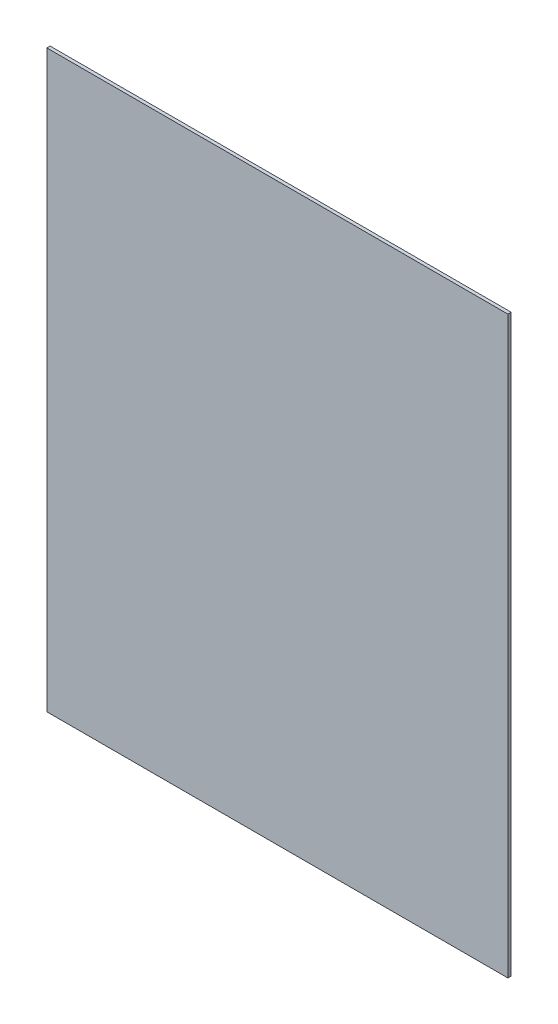
ISO-10303-21;
HEADER;
FILE_DESCRIPTION(('STEP AP214'),'2;1');
FILE_NAME('part.step','',(''),(''),'','','');
FILE_SCHEMA(('AUTOMOTIVE_DESIGN { 1 0 10303 214 1 1 1 1 }'));
ENDSEC;
DATA;
#1=APPLICATION_CONTEXT('core data for automotive mechanical design processes');
#2=APPLICATION_PROTOCOL_DEFINITION('international standard','automotive_design',2000,#1);
#3=PRODUCT_CONTEXT('',#1,'mechanical');
#4=PRODUCT('Part','Part','',(#3));
#5=PRODUCT_RELATED_PRODUCT_CATEGORY('part','',(#4));
#6=PRODUCT_DEFINITION_FORMATION('','',#4);
#7=PRODUCT_DEFINITION_CONTEXT('part definition',#1,'design');
#8=PRODUCT_DEFINITION('design','',#6,#7);
#9=PRODUCT_DEFINITION_SHAPE('','',#8);
#10=(LENGTH_UNIT() NAMED_UNIT(*) SI_UNIT(.MILLI.,.METRE.));
#11=(NAMED_UNIT(*) PLANE_ANGLE_UNIT() SI_UNIT($,.RADIAN.));
#12=(NAMED_UNIT(*) SI_UNIT($,.STERADIAN.) SOLID_ANGLE_UNIT());
#13=UNCERTAINTY_MEASURE_WITH_UNIT(LENGTH_MEASURE(1.E-05),#10,'distance_accuracy_value','');
#14=(GEOMETRIC_REPRESENTATION_CONTEXT(3) GLOBAL_UNCERTAINTY_ASSIGNED_CONTEXT((#13)) GLOBAL_UNIT_ASSIGNED_CONTEXT((#10,
#11,#12)) REPRESENTATION_CONTEXT('',''));
#15=CARTESIAN_POINT('',(0.,0.,0.));
#16=DIRECTION('',(0.,0.,1.));
#17=DIRECTION('',(1.,0.,0.));
#18=AXIS2_PLACEMENT_3D('',#15,#16,#17);
#19=CARTESIAN_POINT('',(0.,0.,3.175));
#20=DIRECTION('',(1.,0.,0.));
#21=DIRECTION('',(0.,0.,-1.));
#22=AXIS2_PLACEMENT_3D('',#19,#20,#21);
#23=PLANE('',#22);
#24=DIRECTION('',(0.,-1.,0.));
#25=VECTOR('',#24,1.);
#26=CARTESIAN_POINT('',(0.,0.,0.));
#27=LINE('',#26,#25);
#28=CARTESIAN_POINT('',(0.,558.8,0.));
#29=VERTEX_POINT('',#28);
#30=CARTESIAN_POINT('',(0.,0.,0.));
#31=VERTEX_POINT('',#30);
#32=EDGE_CURVE('E96',#29,#31,#27,.T.);
#33=ORIENTED_EDGE('',*,*,#32,.T.);
#34=DIRECTION('',(0.,0.,-1.));
#35=VECTOR('',#34,1.);
#36=CARTESIAN_POINT('',(0.,0.,3.175));
#37=LINE('',#36,#35);
#38=CARTESIAN_POINT('',(0.,0.,3.175));
#39=VERTEX_POINT('',#38);
#40=EDGE_CURVE('E11',#39,#31,#37,.T.);
#41=ORIENTED_EDGE('',*,*,#40,.F.);
#42=DIRECTION('',(0.,-1.,0.));
#43=VECTOR('',#42,1.);
#44=CARTESIAN_POINT('',(0.,0.,3.175));
#45=LINE('',#44,#43);
#46=CARTESIAN_POINT('',(0.,558.8,3.175));
#47=VERTEX_POINT('',#46);
#48=EDGE_CURVE('E84',#47,#39,#45,.T.);
#49=ORIENTED_EDGE('',*,*,#48,.F.);
#50=DIRECTION('',(0.,0.,-1.));
#51=VECTOR('',#50,1.);
#52=CARTESIAN_POINT('',(0.,558.8,3.175));
#53=LINE('',#52,#51);
#54=EDGE_CURVE('E92',#47,#29,#53,.T.);
#55=ORIENTED_EDGE('',*,*,#54,.T.);
#56=EDGE_LOOP('',(#33,#41,#49,#55));
#57=FACE_BOUND('',#56,.T.);
#58=ADVANCED_FACE('F33',(#57),#23,.F.);
#59=CARTESIAN_POINT('',(0.,0.,3.175));
#60=DIRECTION('',(0.,1.,0.));
#61=DIRECTION('',(0.,0.,1.));
#62=AXIS2_PLACEMENT_3D('',#59,#60,#61);
#63=PLANE('',#62);
#64=DIRECTION('',(1.,0.,0.));
#65=VECTOR('',#64,1.);
#66=CARTESIAN_POINT('',(0.,0.,0.));
#67=LINE('',#66,#65);
#68=CARTESIAN_POINT('',(448.1322,0.,0.));
#69=VERTEX_POINT('',#68);
#70=EDGE_CURVE('E88',#31,#69,#67,.T.);
#71=ORIENTED_EDGE('',*,*,#70,.T.);
#72=DIRECTION('',(0.,0.,-1.));
#73=VECTOR('',#72,1.);
#74=CARTESIAN_POINT('',(448.1322,0.,3.175));
#75=LINE('',#74,#73);
#76=CARTESIAN_POINT('',(448.1322,0.,3.175));
#77=VERTEX_POINT('',#76);
#78=EDGE_CURVE('E41',#77,#69,#75,.T.);
#79=ORIENTED_EDGE('',*,*,#78,.F.);
#80=DIRECTION('',(1.,0.,0.));
#81=VECTOR('',#80,1.);
#82=CARTESIAN_POINT('',(0.,0.,3.175));
#83=LINE('',#82,#81);
#84=EDGE_CURVE('E79',#39,#77,#83,.T.);
#85=ORIENTED_EDGE('',*,*,#84,.F.);
#86=ORIENTED_EDGE('',*,*,#40,.T.);
#87=EDGE_LOOP('',(#71,#79,#85,#86));
#88=FACE_BOUND('',#87,.T.);
#89=ADVANCED_FACE('F87',(#88),#63,.F.);
#90=CARTESIAN_POINT('',(448.1322,0.,3.175));
#91=DIRECTION('',(-1.,0.,0.));
#92=DIRECTION('',(0.,0.,1.));
#93=AXIS2_PLACEMENT_3D('',#90,#91,#92);
#94=PLANE('',#93);
#95=DIRECTION('',(0.,1.,0.));
#96=VECTOR('',#95,1.);
#97=CARTESIAN_POINT('',(448.1322,0.,0.));
#98=LINE('',#97,#96);
#99=CARTESIAN_POINT('',(448.1322,558.8,0.));
#100=VERTEX_POINT('',#99);
#101=EDGE_CURVE('E66',#69,#100,#98,.T.);
#102=ORIENTED_EDGE('',*,*,#101,.T.);
#103=DIRECTION('',(0.,0.,-1.));
#104=VECTOR('',#103,1.);
#105=CARTESIAN_POINT('',(448.1322,558.8,3.175));
#106=LINE('',#105,#104);
#107=CARTESIAN_POINT('',(448.1322,558.8,3.175));
#108=VERTEX_POINT('',#107);
#109=EDGE_CURVE('E89',#108,#100,#106,.T.);
#110=ORIENTED_EDGE('',*,*,#109,.F.);
#111=DIRECTION('',(0.,1.,0.));
#112=VECTOR('',#111,1.);
#113=CARTESIAN_POINT('',(448.1322,0.,3.175));
#114=LINE('',#113,#112);
#115=EDGE_CURVE('E82',#77,#108,#114,.T.);
#116=ORIENTED_EDGE('',*,*,#115,.F.);
#117=ORIENTED_EDGE('',*,*,#78,.T.);
#118=EDGE_LOOP('',(#102,#110,#116,#117));
#119=FACE_BOUND('',#118,.T.);
#120=ADVANCED_FACE('F90',(#119),#94,.F.);
#121=CARTESIAN_POINT('',(0.,558.8,3.175));
#122=DIRECTION('',(0.,-1.,0.));
#123=DIRECTION('',(0.,0.,-1.));
#124=AXIS2_PLACEMENT_3D('',#121,#122,#123);
#125=PLANE('',#124);
#126=DIRECTION('',(-1.,0.,0.));
#127=VECTOR('',#126,1.);
#128=CARTESIAN_POINT('',(0.,558.8,0.));
#129=LINE('',#128,#127);
#130=EDGE_CURVE('E72',#100,#29,#129,.T.);
#131=ORIENTED_EDGE('',*,*,#130,.T.);
#132=ORIENTED_EDGE('',*,*,#54,.F.);
#133=DIRECTION('',(-1.,0.,0.));
#134=VECTOR('',#133,1.);
#135=CARTESIAN_POINT('',(0.,558.8,3.175));
#136=LINE('',#135,#134);
#137=EDGE_CURVE('E49',#108,#47,#136,.T.);
#138=ORIENTED_EDGE('',*,*,#137,.F.);
#139=ORIENTED_EDGE('',*,*,#109,.T.);
#140=EDGE_LOOP('',(#131,#132,#138,#139));
#141=FACE_BOUND('',#140,.T.);
#142=ADVANCED_FACE('F103',(#141),#125,.F.);
#143=CARTESIAN_POINT('',(0.,0.,3.175));
#144=DIRECTION('',(0.,0.,-1.));
#145=DIRECTION('',(-1.,0.,0.));
#146=AXIS2_PLACEMENT_3D('',#143,#144,#145);
#147=PLANE('',#146);
#148=ORIENTED_EDGE('',*,*,#48,.T.);
#149=ORIENTED_EDGE('',*,*,#84,.T.);
#150=ORIENTED_EDGE('',*,*,#115,.T.);
#151=ORIENTED_EDGE('',*,*,#137,.T.);
#152=EDGE_LOOP('',(#148,#149,#150,#151));
#153=FACE_BOUND('',#152,.T.);
#154=ADVANCED_FACE('F80',(#153),#147,.F.);
#155=CARTESIAN_POINT('',(0.,0.,0.));
#156=DIRECTION('',(0.,0.,-1.));
#157=DIRECTION('',(-1.,0.,0.));
#158=AXIS2_PLACEMENT_3D('',#155,#156,#157);
#159=PLANE('',#158);
#160=ORIENTED_EDGE('',*,*,#32,.F.);
#161=ORIENTED_EDGE('',*,*,#130,.F.);
#162=ORIENTED_EDGE('',*,*,#101,.F.);
#163=ORIENTED_EDGE('',*,*,#70,.F.);
#164=EDGE_LOOP('',(#160,#161,#162,#163));
#165=FACE_BOUND('',#164,.T.);
#166=ADVANCED_FACE('F106',(#165),#159,.T.);
#167=CLOSED_SHELL('',(#58,#89,#120,#142,#154,#166));
#168=MANIFOLD_SOLID_BREP('B2',#167);
#169=ADVANCED_BREP_SHAPE_REPRESENTATION('',(#18,#168),#14);
#170=SHAPE_DEFINITION_REPRESENTATION(#9,#169);
ENDSEC;
END-ISO-10303-21;
